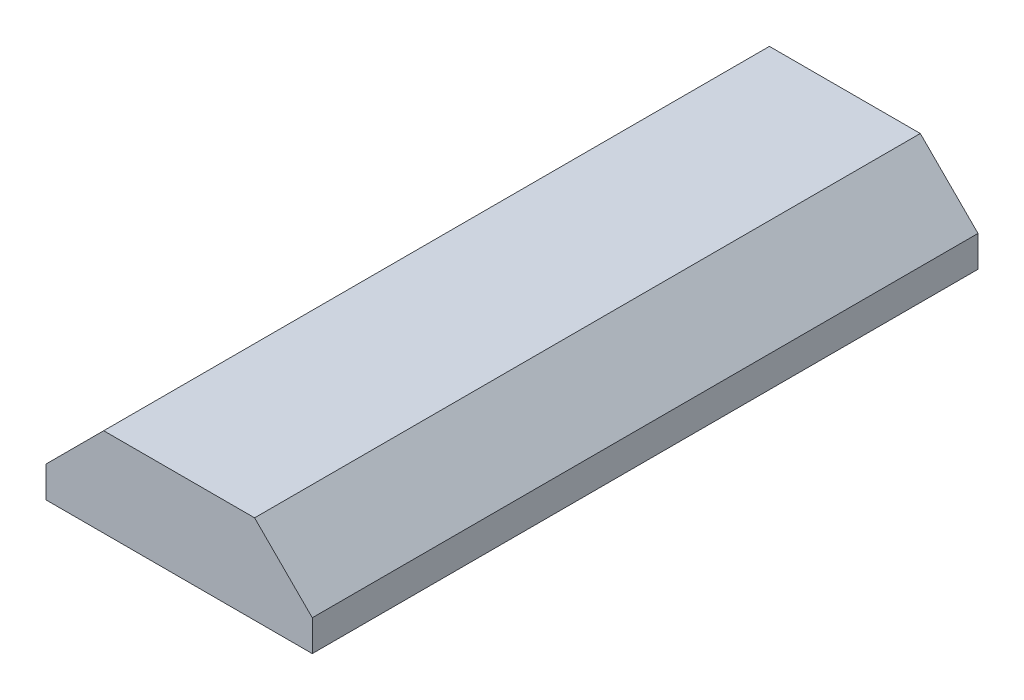
ISO-10303-21;
HEADER;
FILE_DESCRIPTION(('STEP AP214'),'2;1');
FILE_NAME('part.step','',(''),(''),'','','');
FILE_SCHEMA(('AUTOMOTIVE_DESIGN { 1 0 10303 214 1 1 1 1 }'));
ENDSEC;
DATA;
#1=APPLICATION_CONTEXT('core data for automotive mechanical design processes');
#2=APPLICATION_PROTOCOL_DEFINITION('international standard','automotive_design',2000,#1);
#3=PRODUCT_CONTEXT('',#1,'mechanical');
#4=PRODUCT('Part','Part','',(#3));
#5=PRODUCT_RELATED_PRODUCT_CATEGORY('part','',(#4));
#6=PRODUCT_DEFINITION_FORMATION('','',#4);
#7=PRODUCT_DEFINITION_CONTEXT('part definition',#1,'design');
#8=PRODUCT_DEFINITION('design','',#6,#7);
#9=PRODUCT_DEFINITION_SHAPE('','',#8);
#10=(LENGTH_UNIT() NAMED_UNIT(*) SI_UNIT(.MILLI.,.METRE.));
#11=(NAMED_UNIT(*) PLANE_ANGLE_UNIT() SI_UNIT($,.RADIAN.));
#12=(NAMED_UNIT(*) SI_UNIT($,.STERADIAN.) SOLID_ANGLE_UNIT());
#13=UNCERTAINTY_MEASURE_WITH_UNIT(LENGTH_MEASURE(1.E-05),#10,'distance_accuracy_value','');
#14=(GEOMETRIC_REPRESENTATION_CONTEXT(3) GLOBAL_UNCERTAINTY_ASSIGNED_CONTEXT((#13)) GLOBAL_UNIT_ASSIGNED_CONTEXT((#10,
#11,#12)) REPRESENTATION_CONTEXT('',''));
#15=CARTESIAN_POINT('',(0.,0.,0.));
#16=DIRECTION('',(0.,0.,1.));
#17=DIRECTION('',(1.,0.,0.));
#18=AXIS2_PLACEMENT_3D('',#15,#16,#17);
#19=CARTESIAN_POINT('',(3.4,1.80885878693797,30.));
#20=DIRECTION('',(0.707106781186549,0.707106781186546,0.));
#21=DIRECTION('',(-0.707106781186546,0.707106781186549,0.));
#22=AXIS2_PLACEMENT_3D('',#19,#20,#21);
#23=PLANE('',#22);
#24=DIRECTION('',(0.707106781186546,-0.707106781186549,0.));
#25=VECTOR('',#24,1.);
#26=CARTESIAN_POINT('',(3.4,1.80885878693797,0.));
#27=LINE('',#26,#25);
#28=CARTESIAN_POINT('',(3.4,1.80885878693797,0.));
#29=VERTEX_POINT('',#28);
#30=CARTESIAN_POINT('',(6.,-0.791141213062042,0.));
#31=VERTEX_POINT('',#30);
#32=EDGE_CURVE('E127',#29,#31,#27,.T.);
#33=ORIENTED_EDGE('',*,*,#32,.F.);
#34=DIRECTION('',(0.,0.,-1.));
#35=VECTOR('',#34,1.);
#36=CARTESIAN_POINT('',(3.4,1.80885878693797,30.));
#37=LINE('',#36,#35);
#38=CARTESIAN_POINT('',(3.4,1.80885878693797,30.));
#39=VERTEX_POINT('',#38);
#40=EDGE_CURVE('E11',#39,#29,#37,.T.);
#41=ORIENTED_EDGE('',*,*,#40,.F.);
#42=DIRECTION('',(0.707106781186546,-0.707106781186549,0.));
#43=VECTOR('',#42,1.);
#44=CARTESIAN_POINT('',(3.4,1.80885878693797,30.));
#45=LINE('',#44,#43);
#46=CARTESIAN_POINT('',(6.,-0.791141213062042,30.));
#47=VERTEX_POINT('',#46);
#48=EDGE_CURVE('E139',#39,#47,#45,.T.);
#49=ORIENTED_EDGE('',*,*,#48,.T.);
#50=DIRECTION('',(0.,0.,-1.));
#51=VECTOR('',#50,1.);
#52=CARTESIAN_POINT('',(6.,-0.791141213062042,30.));
#53=LINE('',#52,#51);
#54=EDGE_CURVE('E44',#47,#31,#53,.T.);
#55=ORIENTED_EDGE('',*,*,#54,.T.);
#56=EDGE_LOOP('',(#33,#41,#49,#55));
#57=FACE_BOUND('',#56,.T.);
#58=ADVANCED_FACE('F41',(#57),#23,.T.);
#59=CARTESIAN_POINT('',(3.4,1.80885878693797,30.));
#60=DIRECTION('',(0.,-1.,0.));
#61=DIRECTION('',(0.,0.,-1.));
#62=AXIS2_PLACEMENT_3D('',#59,#60,#61);
#63=PLANE('',#62);
#64=DIRECTION('',(-1.,0.,0.));
#65=VECTOR('',#64,1.);
#66=CARTESIAN_POINT('',(3.4,1.80885878693797,0.));
#67=LINE('',#66,#65);
#68=CARTESIAN_POINT('',(-3.4,1.80885878693797,0.));
#69=VERTEX_POINT('',#68);
#70=EDGE_CURVE('E80',#29,#69,#67,.T.);
#71=ORIENTED_EDGE('',*,*,#70,.T.);
#72=DIRECTION('',(0.,0.,-1.));
#73=VECTOR('',#72,1.);
#74=CARTESIAN_POINT('',(-3.4,1.80885878693797,30.));
#75=LINE('',#74,#73);
#76=CARTESIAN_POINT('',(-3.4,1.80885878693797,30.));
#77=VERTEX_POINT('',#76);
#78=EDGE_CURVE('E50',#77,#69,#75,.T.);
#79=ORIENTED_EDGE('',*,*,#78,.F.);
#80=DIRECTION('',(-1.,0.,0.));
#81=VECTOR('',#80,1.);
#82=CARTESIAN_POINT('',(3.4,1.80885878693797,30.));
#83=LINE('',#82,#81);
#84=EDGE_CURVE('E105',#39,#77,#83,.T.);
#85=ORIENTED_EDGE('',*,*,#84,.F.);
#86=ORIENTED_EDGE('',*,*,#40,.T.);
#87=EDGE_LOOP('',(#71,#79,#85,#86));
#88=FACE_BOUND('',#87,.T.);
#89=ADVANCED_FACE('F159',(#88),#63,.F.);
#90=CARTESIAN_POINT('',(-3.4,1.80885878693797,30.));
#91=DIRECTION('',(0.707106781186549,-0.707106781186546,0.));
#92=DIRECTION('',(0.707106781186546,0.707106781186549,0.));
#93=AXIS2_PLACEMENT_3D('',#90,#91,#92);
#94=PLANE('',#93);
#95=DIRECTION('',(-0.707106781186546,-0.707106781186549,0.));
#96=VECTOR('',#95,1.);
#97=CARTESIAN_POINT('',(-3.4,1.80885878693797,0.));
#98=LINE('',#97,#96);
#99=CARTESIAN_POINT('',(-6.,-0.791141213062042,0.));
#100=VERTEX_POINT('',#99);
#101=EDGE_CURVE('E112',#69,#100,#98,.T.);
#102=ORIENTED_EDGE('',*,*,#101,.T.);
#103=DIRECTION('',(0.,0.,-1.));
#104=VECTOR('',#103,1.);
#105=CARTESIAN_POINT('',(-6.,-0.791141213062042,30.));
#106=LINE('',#105,#104);
#107=CARTESIAN_POINT('',(-6.,-0.791141213062042,30.));
#108=VERTEX_POINT('',#107);
#109=EDGE_CURVE('E109',#108,#100,#106,.T.);
#110=ORIENTED_EDGE('',*,*,#109,.F.);
#111=DIRECTION('',(-0.707106781186546,-0.707106781186549,0.));
#112=VECTOR('',#111,1.);
#113=CARTESIAN_POINT('',(-3.4,1.80885878693797,30.));
#114=LINE('',#113,#112);
#115=EDGE_CURVE('E98',#77,#108,#114,.T.);
#116=ORIENTED_EDGE('',*,*,#115,.F.);
#117=ORIENTED_EDGE('',*,*,#78,.T.);
#118=EDGE_LOOP('',(#102,#110,#116,#117));
#119=FACE_BOUND('',#118,.T.);
#120=ADVANCED_FACE('F110',(#119),#94,.F.);
#121=CARTESIAN_POINT('',(-6.,-0.791141213062042,30.));
#122=DIRECTION('',(1.,0.,0.));
#123=DIRECTION('',(0.,0.,-1.));
#124=AXIS2_PLACEMENT_3D('',#121,#122,#123);
#125=PLANE('',#124);
#126=DIRECTION('',(0.,-1.,0.));
#127=VECTOR('',#126,1.);
#128=CARTESIAN_POINT('',(-6.,-0.791141213062042,0.));
#129=LINE('',#128,#127);
#130=CARTESIAN_POINT('',(-6.,-2.19114121306203,0.));
#131=VERTEX_POINT('',#130);
#132=EDGE_CURVE('E136',#100,#131,#129,.T.);
#133=ORIENTED_EDGE('',*,*,#132,.T.);
#134=DIRECTION('',(0.,0.,-1.));
#135=VECTOR('',#134,1.);
#136=CARTESIAN_POINT('',(-6.,-2.19114121306203,30.));
#137=LINE('',#136,#135);
#138=CARTESIAN_POINT('',(-6.,-2.19114121306203,30.));
#139=VERTEX_POINT('',#138);
#140=EDGE_CURVE('E115',#139,#131,#137,.T.);
#141=ORIENTED_EDGE('',*,*,#140,.F.);
#142=DIRECTION('',(0.,-1.,0.));
#143=VECTOR('',#142,1.);
#144=CARTESIAN_POINT('',(-6.,-0.791141213062042,30.));
#145=LINE('',#144,#143);
#146=EDGE_CURVE('E103',#108,#139,#145,.T.);
#147=ORIENTED_EDGE('',*,*,#146,.F.);
#148=ORIENTED_EDGE('',*,*,#109,.T.);
#149=EDGE_LOOP('',(#133,#141,#147,#148));
#150=FACE_BOUND('',#149,.T.);
#151=ADVANCED_FACE('F117',(#150),#125,.F.);
#152=CARTESIAN_POINT('',(-6.,-2.19114121306203,30.));
#153=DIRECTION('',(0.,1.,0.));
#154=DIRECTION('',(0.,0.,1.));
#155=AXIS2_PLACEMENT_3D('',#152,#153,#154);
#156=PLANE('',#155);
#157=DIRECTION('',(1.,0.,0.));
#158=VECTOR('',#157,1.);
#159=CARTESIAN_POINT('',(-6.,-2.19114121306203,0.));
#160=LINE('',#159,#158);
#161=CARTESIAN_POINT('',(6.,-2.19114121306203,0.));
#162=VERTEX_POINT('',#161);
#163=EDGE_CURVE('E133',#131,#162,#160,.T.);
#164=ORIENTED_EDGE('',*,*,#163,.T.);
#165=DIRECTION('',(0.,0.,-1.));
#166=VECTOR('',#165,1.);
#167=CARTESIAN_POINT('',(6.,-2.19114121306203,30.));
#168=LINE('',#167,#166);
#169=CARTESIAN_POINT('',(6.,-2.19114121306203,30.));
#170=VERTEX_POINT('',#169);
#171=EDGE_CURVE('E142',#170,#162,#168,.T.);
#172=ORIENTED_EDGE('',*,*,#171,.F.);
#173=DIRECTION('',(1.,0.,0.));
#174=VECTOR('',#173,1.);
#175=CARTESIAN_POINT('',(-6.,-2.19114121306203,30.));
#176=LINE('',#175,#174);
#177=EDGE_CURVE('E120',#139,#170,#176,.T.);
#178=ORIENTED_EDGE('',*,*,#177,.F.);
#179=ORIENTED_EDGE('',*,*,#140,.T.);
#180=EDGE_LOOP('',(#164,#172,#178,#179));
#181=FACE_BOUND('',#180,.T.);
#182=ADVANCED_FACE('F149',(#181),#156,.F.);
#183=CARTESIAN_POINT('',(6.,-0.791141213062042,30.));
#184=DIRECTION('',(1.,0.,0.));
#185=DIRECTION('',(0.,0.,-1.));
#186=AXIS2_PLACEMENT_3D('',#183,#184,#185);
#187=PLANE('',#186);
#188=DIRECTION('',(0.,-1.,0.));
#189=VECTOR('',#188,1.);
#190=CARTESIAN_POINT('',(6.,-0.791141213062042,0.));
#191=LINE('',#190,#189);
#192=EDGE_CURVE('E130',#31,#162,#191,.T.);
#193=ORIENTED_EDGE('',*,*,#192,.F.);
#194=ORIENTED_EDGE('',*,*,#54,.F.);
#195=DIRECTION('',(0.,-1.,0.));
#196=VECTOR('',#195,1.);
#197=CARTESIAN_POINT('',(6.,-0.791141213062042,30.));
#198=LINE('',#197,#196);
#199=EDGE_CURVE('E122',#47,#170,#198,.T.);
#200=ORIENTED_EDGE('',*,*,#199,.T.);
#201=ORIENTED_EDGE('',*,*,#171,.T.);
#202=EDGE_LOOP('',(#193,#194,#200,#201));
#203=FACE_BOUND('',#202,.T.);
#204=ADVANCED_FACE('F144',(#203),#187,.T.);
#205=CARTESIAN_POINT('',(0.,0.,30.));
#206=DIRECTION('',(0.,0.,-1.));
#207=DIRECTION('',(-1.,0.,0.));
#208=AXIS2_PLACEMENT_3D('',#205,#206,#207);
#209=PLANE('',#208);
#210=ORIENTED_EDGE('',*,*,#48,.F.);
#211=ORIENTED_EDGE('',*,*,#84,.T.);
#212=ORIENTED_EDGE('',*,*,#115,.T.);
#213=ORIENTED_EDGE('',*,*,#146,.T.);
#214=ORIENTED_EDGE('',*,*,#177,.T.);
#215=ORIENTED_EDGE('',*,*,#199,.F.);
#216=EDGE_LOOP('',(#210,#211,#212,#213,#214,#215));
#217=FACE_BOUND('',#216,.T.);
#218=ADVANCED_FACE('F101',(#217),#209,.F.);
#219=CARTESIAN_POINT('',(0.,0.,0.));
#220=DIRECTION('',(0.,0.,-1.));
#221=DIRECTION('',(-1.,0.,0.));
#222=AXIS2_PLACEMENT_3D('',#219,#220,#221);
#223=PLANE('',#222);
#224=ORIENTED_EDGE('',*,*,#32,.T.);
#225=ORIENTED_EDGE('',*,*,#192,.T.);
#226=ORIENTED_EDGE('',*,*,#163,.F.);
#227=ORIENTED_EDGE('',*,*,#132,.F.);
#228=ORIENTED_EDGE('',*,*,#101,.F.);
#229=ORIENTED_EDGE('',*,*,#70,.F.);
#230=EDGE_LOOP('',(#224,#225,#226,#227,#228,#229));
#231=FACE_BOUND('',#230,.T.);
#232=ADVANCED_FACE('F147',(#231),#223,.T.);
#233=CLOSED_SHELL('',(#58,#89,#120,#151,#182,#204,#218,#232));
#234=MANIFOLD_SOLID_BREP('B2',#233);
#235=ADVANCED_BREP_SHAPE_REPRESENTATION('',(#18,#234),#14);
#236=SHAPE_DEFINITION_REPRESENTATION(#9,#235);
ENDSEC;
END-ISO-10303-21;
